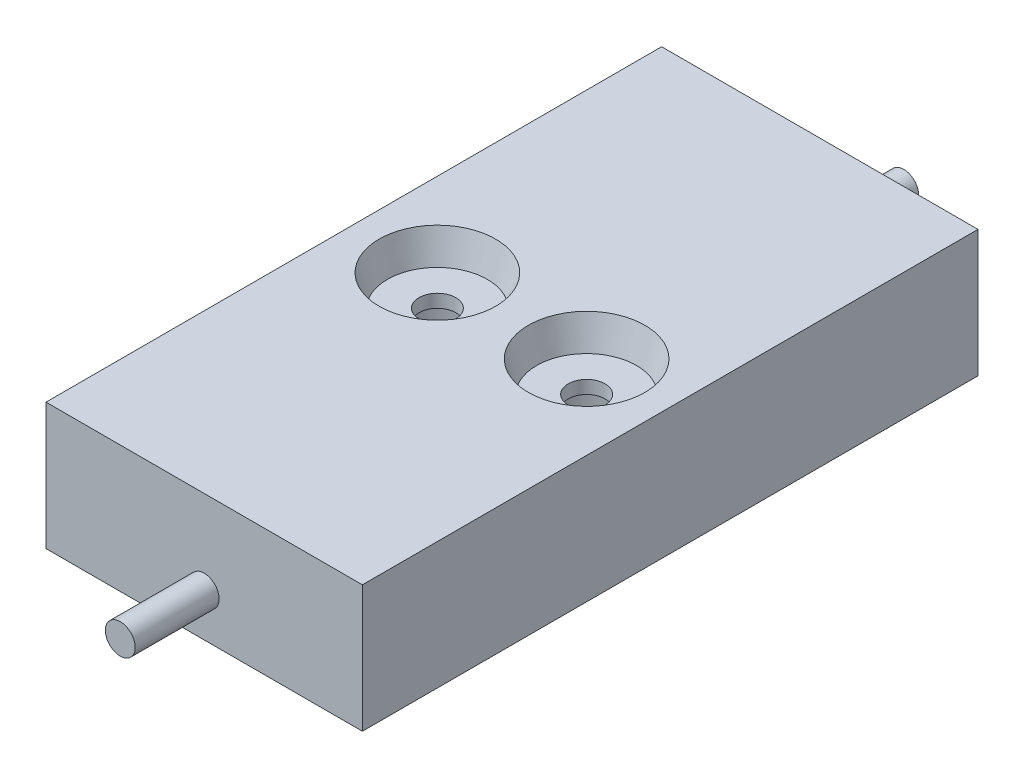
ISO-10303-21;
HEADER;
FILE_DESCRIPTION(('STEP AP214'),'2;1');
FILE_NAME('part.step','',(''),(''),'','','');
FILE_SCHEMA(('AUTOMOTIVE_DESIGN { 1 0 10303 214 1 1 1 1 }'));
ENDSEC;
DATA;
#1=APPLICATION_CONTEXT('core data for automotive mechanical design processes');
#2=APPLICATION_PROTOCOL_DEFINITION('international standard','automotive_design',2000,#1);
#3=PRODUCT_CONTEXT('',#1,'mechanical');
#4=PRODUCT('Part','Part','',(#3));
#5=PRODUCT_RELATED_PRODUCT_CATEGORY('part','',(#4));
#6=PRODUCT_DEFINITION_FORMATION('','',#4);
#7=PRODUCT_DEFINITION_CONTEXT('part definition',#1,'design');
#8=PRODUCT_DEFINITION('design','',#6,#7);
#9=PRODUCT_DEFINITION_SHAPE('','',#8);
#10=(LENGTH_UNIT() NAMED_UNIT(*) SI_UNIT(.MILLI.,.METRE.));
#11=(NAMED_UNIT(*) PLANE_ANGLE_UNIT() SI_UNIT($,.RADIAN.));
#12=(NAMED_UNIT(*) SI_UNIT($,.STERADIAN.) SOLID_ANGLE_UNIT());
#13=UNCERTAINTY_MEASURE_WITH_UNIT(LENGTH_MEASURE(1.E-05),#10,'distance_accuracy_value','');
#14=(GEOMETRIC_REPRESENTATION_CONTEXT(3) GLOBAL_UNCERTAINTY_ASSIGNED_CONTEXT((#13)) GLOBAL_UNIT_ASSIGNED_CONTEXT((#10,
#11,#12)) REPRESENTATION_CONTEXT('',''));
#15=CARTESIAN_POINT('',(0.,0.,0.));
#16=DIRECTION('',(0.,0.,1.));
#17=DIRECTION('',(1.,0.,0.));
#18=AXIS2_PLACEMENT_3D('',#15,#16,#17);
#19=CARTESIAN_POINT('',(0.,-12.5,105.));
#20=DIRECTION('',(0.,0.,-1.));
#21=DIRECTION('',(-1.,0.,0.));
#22=AXIS2_PLACEMENT_3D('',#19,#20,#21);
#23=CYLINDRICAL_SURFACE('',#22,4.);
#24=CARTESIAN_POINT('',(0.,-12.5,105.));
#25=DIRECTION('',(0.,0.,1.));
#26=DIRECTION('',(1.,0.,0.));
#27=AXIS2_PLACEMENT_3D('',#24,#25,#26);
#28=CIRCLE('',#27,4.);
#29=CARTESIAN_POINT('',(4.,-12.5,105.));
#30=VERTEX_POINT('',#29);
#31=EDGE_CURVE('E12',#30,#30,#28,.T.);
#32=ORIENTED_EDGE('',*,*,#31,.F.);
#33=EDGE_LOOP('',(#32));
#34=FACE_BOUND('',#33,.T.);
#35=CARTESIAN_POINT('',(0.,-12.5,-105.));
#36=DIRECTION('',(0.,0.,1.));
#37=DIRECTION('',(1.,0.,0.));
#38=AXIS2_PLACEMENT_3D('',#35,#36,#37);
#39=CIRCLE('',#38,4.);
#40=CARTESIAN_POINT('',(4.,-12.5,-105.));
#41=VERTEX_POINT('',#40);
#42=EDGE_CURVE('E62',#41,#41,#39,.T.);
#43=ORIENTED_EDGE('',*,*,#42,.T.);
#44=EDGE_LOOP('',(#43));
#45=FACE_BOUND('',#44,.T.);
#46=ADVANCED_FACE('F59',(#34,#45),#23,.T.);
#47=CARTESIAN_POINT('',(0.,-12.5,105.));
#48=DIRECTION('',(0.,0.,1.));
#49=DIRECTION('',(1.,0.,0.));
#50=AXIS2_PLACEMENT_3D('',#47,#48,#49);
#51=PLANE('',#50);
#52=ORIENTED_EDGE('',*,*,#31,.T.);
#53=EDGE_LOOP('',(#52));
#54=FACE_BOUND('',#53,.T.);
#55=ADVANCED_FACE('F77',(#54),#51,.T.);
#56=CARTESIAN_POINT('',(0.,-12.5,-105.));
#57=DIRECTION('',(0.,0.,1.));
#58=DIRECTION('',(1.,0.,0.));
#59=AXIS2_PLACEMENT_3D('',#56,#57,#58);
#60=PLANE('',#59);
#61=ORIENTED_EDGE('',*,*,#42,.F.);
#62=EDGE_LOOP('',(#61));
#63=FACE_BOUND('',#62,.T.);
#64=ADVANCED_FACE('F75',(#63),#60,.F.);
#65=CLOSED_SHELL('',(#46,#55,#64));
#66=MANIFOLD_SOLID_BREP('B2_NOT_SHOWN',#65);
#67=CARTESIAN_POINT('',(0.,-1.75,0.));
#68=DIRECTION('',(0.,1.,0.));
#69=DIRECTION('',(0.,0.,1.));
#70=AXIS2_PLACEMENT_3D('',#67,#68,#69);
#71=PLANE('',#70);
#72=CARTESIAN_POINT('',(20.,-1.75,0.));
#73=DIRECTION('',(0.,1.,0.));
#74=DIRECTION('',(0.,0.,1.));
#75=AXIS2_PLACEMENT_3D('',#72,#73,#74);
#76=CIRCLE('',#75,4.92500000000001);
#77=CARTESIAN_POINT('',(20.,-1.75,4.92500000000001));
#78=VERTEX_POINT('',#77);
#79=EDGE_CURVE('E210',#78,#78,#76,.T.);
#80=ORIENTED_EDGE('',*,*,#79,.T.);
#81=EDGE_LOOP('',(#80));
#82=FACE_BOUND('',#81,.T.);
#83=CARTESIAN_POINT('',(20.,-1.75,0.));
#84=DIRECTION('',(0.,1.,0.));
#85=DIRECTION('',(0.,0.,1.));
#86=AXIS2_PLACEMENT_3D('',#83,#84,#85);
#87=CIRCLE('',#86,13.4);
#88=CARTESIAN_POINT('',(20.,-1.75,13.4));
#89=VERTEX_POINT('',#88);
#90=EDGE_CURVE('E194',#89,#89,#87,.F.);
#91=ORIENTED_EDGE('',*,*,#90,.T.);
#92=EDGE_LOOP('',(#91));
#93=FACE_BOUND('',#92,.T.);
#94=ADVANCED_FACE('F105',(#82,#93),#71,.F.);
#95=CARTESIAN_POINT('',(0.,1.75,0.));
#96=DIRECTION('',(0.,1.,0.));
#97=DIRECTION('',(0.,0.,1.));
#98=AXIS2_PLACEMENT_3D('',#95,#96,#97);
#99=PLANE('',#98);
#100=CARTESIAN_POINT('',(20.,1.75,0.));
#101=DIRECTION('',(0.,1.,0.));
#102=DIRECTION('',(0.,0.,1.));
#103=AXIS2_PLACEMENT_3D('',#100,#101,#102);
#104=CIRCLE('',#103,4.92500000000001);
#105=CARTESIAN_POINT('',(20.,1.75,4.92500000000001));
#106=VERTEX_POINT('',#105);
#107=EDGE_CURVE('E203',#106,#106,#104,.T.);
#108=ORIENTED_EDGE('',*,*,#107,.F.);
#109=EDGE_LOOP('',(#108));
#110=FACE_BOUND('',#109,.T.);
#111=CARTESIAN_POINT('',(20.,1.75,0.));
#112=DIRECTION('',(0.,1.,0.));
#113=DIRECTION('',(0.,0.,1.));
#114=AXIS2_PLACEMENT_3D('',#111,#112,#113);
#115=CIRCLE('',#114,13.4);
#116=CARTESIAN_POINT('',(20.,1.75,13.4));
#117=VERTEX_POINT('',#116);
#118=EDGE_CURVE('E213',#117,#117,#115,.T.);
#119=ORIENTED_EDGE('',*,*,#118,.T.);
#120=EDGE_LOOP('',(#119));
#121=FACE_BOUND('',#120,.T.);
#122=ADVANCED_FACE('F251',(#110,#121),#99,.T.);
#123=CARTESIAN_POINT('',(42.4,1.75,0.));
#124=DIRECTION('',(1.,0.,0.));
#125=DIRECTION('',(0.,0.,-1.));
#126=AXIS2_PLACEMENT_3D('',#123,#124,#125);
#127=PLANE('',#126);
#128=DIRECTION('',(0.,-1.,0.));
#129=VECTOR('',#128,1.);
#130=CARTESIAN_POINT('',(42.4,1.75,82.5));
#131=LINE('',#130,#129);
#132=CARTESIAN_POINT('',(42.4,10.,82.5));
#133=VERTEX_POINT('',#132);
#134=CARTESIAN_POINT('',(42.4,-24.,82.5));
#135=VERTEX_POINT('',#134);
#136=EDGE_CURVE('E122',#133,#135,#131,.T.);
#137=ORIENTED_EDGE('',*,*,#136,.T.);
#138=DIRECTION('',(0.,0.,1.));
#139=VECTOR('',#138,1.);
#140=CARTESIAN_POINT('',(42.4,-24.,0.));
#141=LINE('',#140,#139);
#142=CARTESIAN_POINT('',(42.4,-24.,-82.5));
#143=VERTEX_POINT('',#142);
#144=EDGE_CURVE('E173',#143,#135,#141,.T.);
#145=ORIENTED_EDGE('',*,*,#144,.F.);
#146=DIRECTION('',(0.,-1.,0.));
#147=VECTOR('',#146,1.);
#148=CARTESIAN_POINT('',(42.4,1.75,-82.5));
#149=LINE('',#148,#147);
#150=CARTESIAN_POINT('',(42.4,10.,-82.5));
#151=VERTEX_POINT('',#150);
#152=EDGE_CURVE('E154',#151,#143,#149,.T.);
#153=ORIENTED_EDGE('',*,*,#152,.F.);
#154=DIRECTION('',(0.,0.,1.));
#155=VECTOR('',#154,1.);
#156=CARTESIAN_POINT('',(42.4,10.,0.));
#157=LINE('',#156,#155);
#158=EDGE_CURVE('E195',#151,#133,#157,.T.);
#159=ORIENTED_EDGE('',*,*,#158,.T.);
#160=EDGE_LOOP('',(#137,#145,#153,#159));
#161=FACE_BOUND('',#160,.T.);
#162=ADVANCED_FACE('F176',(#161),#127,.T.);
#163=CARTESIAN_POINT('',(0.,1.75,-82.5));
#164=DIRECTION('',(0.,0.,-1.));
#165=DIRECTION('',(-1.,0.,0.));
#166=AXIS2_PLACEMENT_3D('',#163,#164,#165);
#167=PLANE('',#166);
#168=CARTESIAN_POINT('',(0.,-12.5,-82.5));
#169=DIRECTION('',(0.,0.,1.));
#170=DIRECTION('',(1.,0.,0.));
#171=AXIS2_PLACEMENT_3D('',#168,#169,#170);
#172=CIRCLE('',#171,4.);
#173=CARTESIAN_POINT('',(4.,-12.5,-82.5));
#174=VERTEX_POINT('',#173);
#175=EDGE_CURVE('E177',#174,#174,#172,.T.);
#176=ORIENTED_EDGE('',*,*,#175,.T.);
#177=EDGE_LOOP('',(#176));
#178=FACE_BOUND('',#177,.T.);
#179=ORIENTED_EDGE('',*,*,#152,.T.);
#180=DIRECTION('',(1.,0.,0.));
#181=VECTOR('',#180,1.);
#182=CARTESIAN_POINT('',(0.,-24.,-82.5));
#183=LINE('',#182,#181);
#184=CARTESIAN_POINT('',(-42.4,-24.,-82.5));
#185=VERTEX_POINT('',#184);
#186=EDGE_CURVE('E157',#185,#143,#183,.T.);
#187=ORIENTED_EDGE('',*,*,#186,.F.);
#188=DIRECTION('',(0.,-1.,0.));
#189=VECTOR('',#188,1.);
#190=CARTESIAN_POINT('',(-42.4,1.75,-82.5));
#191=LINE('',#190,#189);
#192=CARTESIAN_POINT('',(-42.4,10.,-82.5));
#193=VERTEX_POINT('',#192);
#194=EDGE_CURVE('E166',#193,#185,#191,.T.);
#195=ORIENTED_EDGE('',*,*,#194,.F.);
#196=DIRECTION('',(1.,0.,0.));
#197=VECTOR('',#196,1.);
#198=CARTESIAN_POINT('',(0.,10.,-82.5));
#199=LINE('',#198,#197);
#200=EDGE_CURVE('E160',#193,#151,#199,.T.);
#201=ORIENTED_EDGE('',*,*,#200,.T.);
#202=EDGE_LOOP('',(#179,#187,#195,#201));
#203=FACE_BOUND('',#202,.T.);
#204=ADVANCED_FACE('F156',(#178,#203),#167,.T.);
#205=CARTESIAN_POINT('',(-42.4,1.75,0.));
#206=DIRECTION('',(1.,0.,0.));
#207=DIRECTION('',(0.,0.,-1.));
#208=AXIS2_PLACEMENT_3D('',#205,#206,#207);
#209=PLANE('',#208);
#210=ORIENTED_EDGE('',*,*,#194,.T.);
#211=DIRECTION('',(0.,0.,1.));
#212=VECTOR('',#211,1.);
#213=CARTESIAN_POINT('',(-42.4,-24.,0.));
#214=LINE('',#213,#212);
#215=CARTESIAN_POINT('',(-42.4,-24.,82.5));
#216=VERTEX_POINT('',#215);
#217=EDGE_CURVE('E174',#185,#216,#214,.T.);
#218=ORIENTED_EDGE('',*,*,#217,.T.);
#219=DIRECTION('',(0.,-1.,0.));
#220=VECTOR('',#219,1.);
#221=CARTESIAN_POINT('',(-42.4,1.75,82.5));
#222=LINE('',#221,#220);
#223=CARTESIAN_POINT('',(-42.4,10.,82.5));
#224=VERTEX_POINT('',#223);
#225=EDGE_CURVE('E132',#224,#216,#222,.T.);
#226=ORIENTED_EDGE('',*,*,#225,.F.);
#227=DIRECTION('',(0.,0.,1.));
#228=VECTOR('',#227,1.);
#229=CARTESIAN_POINT('',(-42.4,10.,0.));
#230=LINE('',#229,#228);
#231=EDGE_CURVE('E198',#193,#224,#230,.T.);
#232=ORIENTED_EDGE('',*,*,#231,.F.);
#233=EDGE_LOOP('',(#210,#218,#226,#232));
#234=FACE_BOUND('',#233,.T.);
#235=ADVANCED_FACE('F284',(#234),#209,.F.);
#236=CARTESIAN_POINT('',(20.,1.75,0.));
#237=DIRECTION('',(0.,-1.,0.));
#238=DIRECTION('',(0.,0.,-1.));
#239=AXIS2_PLACEMENT_3D('',#236,#237,#238);
#240=CYLINDRICAL_SURFACE('',#239,4.92500000000001);
#241=ORIENTED_EDGE('',*,*,#107,.T.);
#242=EDGE_LOOP('',(#241));
#243=FACE_BOUND('',#242,.T.);
#244=ORIENTED_EDGE('',*,*,#79,.F.);
#245=EDGE_LOOP('',(#244));
#246=FACE_BOUND('',#245,.T.);
#247=ADVANCED_FACE('F279',(#243,#246),#240,.F.);
#248=CARTESIAN_POINT('',(0.,1.75,82.5));
#249=DIRECTION('',(0.,0.,-1.));
#250=DIRECTION('',(-1.,0.,0.));
#251=AXIS2_PLACEMENT_3D('',#248,#249,#250);
#252=PLANE('',#251);
#253=CARTESIAN_POINT('',(0.,-12.5,82.5));
#254=DIRECTION('',(0.,0.,1.));
#255=DIRECTION('',(1.,0.,0.));
#256=AXIS2_PLACEMENT_3D('',#253,#254,#255);
#257=CIRCLE('',#256,4.);
#258=CARTESIAN_POINT('',(4.,-12.5,82.5));
#259=VERTEX_POINT('',#258);
#260=EDGE_CURVE('E181',#259,#259,#257,.T.);
#261=ORIENTED_EDGE('',*,*,#260,.F.);
#262=EDGE_LOOP('',(#261));
#263=FACE_BOUND('',#262,.T.);
#264=ORIENTED_EDGE('',*,*,#225,.T.);
#265=DIRECTION('',(1.,0.,0.));
#266=VECTOR('',#265,1.);
#267=CARTESIAN_POINT('',(0.,-24.,82.5));
#268=LINE('',#267,#266);
#269=EDGE_CURVE('E186',#216,#135,#268,.T.);
#270=ORIENTED_EDGE('',*,*,#269,.T.);
#271=ORIENTED_EDGE('',*,*,#136,.F.);
#272=DIRECTION('',(1.,0.,0.));
#273=VECTOR('',#272,1.);
#274=CARTESIAN_POINT('',(0.,10.,82.5));
#275=LINE('',#274,#273);
#276=EDGE_CURVE('E200',#224,#133,#275,.T.);
#277=ORIENTED_EDGE('',*,*,#276,.F.);
#278=EDGE_LOOP('',(#264,#270,#271,#277));
#279=FACE_BOUND('',#278,.T.);
#280=ADVANCED_FACE('F274',(#263,#279),#252,.F.);
#281=CARTESIAN_POINT('',(-20.,1.75,0.));
#282=DIRECTION('',(0.,-1.,0.));
#283=DIRECTION('',(0.,0.,-1.));
#284=AXIS2_PLACEMENT_3D('',#281,#282,#283);
#285=CYLINDRICAL_SURFACE('',#284,4.925);
#286=CARTESIAN_POINT('',(-20.,1.75,0.));
#287=DIRECTION('',(0.,1.,0.));
#288=DIRECTION('',(0.,0.,1.));
#289=AXIS2_PLACEMENT_3D('',#286,#287,#288);
#290=CIRCLE('',#289,4.925);
#291=CARTESIAN_POINT('',(-20.,1.75,4.925));
#292=VERTEX_POINT('',#291);
#293=EDGE_CURVE('E206',#292,#292,#290,.T.);
#294=ORIENTED_EDGE('',*,*,#293,.T.);
#295=EDGE_LOOP('',(#294));
#296=FACE_BOUND('',#295,.T.);
#297=CARTESIAN_POINT('',(-20.,-1.75,0.));
#298=DIRECTION('',(0.,1.,0.));
#299=DIRECTION('',(0.,0.,1.));
#300=AXIS2_PLACEMENT_3D('',#297,#298,#299);
#301=CIRCLE('',#300,4.925);
#302=CARTESIAN_POINT('',(-20.,-1.75,4.925));
#303=VERTEX_POINT('',#302);
#304=EDGE_CURVE('E207',#303,#303,#301,.T.);
#305=ORIENTED_EDGE('',*,*,#304,.F.);
#306=EDGE_LOOP('',(#305));
#307=FACE_BOUND('',#306,.T.);
#308=ADVANCED_FACE('F267',(#296,#307),#285,.F.);
#309=CARTESIAN_POINT('',(-20.,1.75,0.));
#310=DIRECTION('',(0.,1.,0.));
#311=DIRECTION('',(0.,0.,1.));
#312=AXIS2_PLACEMENT_3D('',#309,#310,#311);
#313=CIRCLE('',#312,13.4);
#314=CARTESIAN_POINT('',(-20.,1.75,13.4));
#315=VERTEX_POINT('',#314);
#316=EDGE_CURVE('E114',#315,#315,#313,.F.);
#317=ORIENTED_EDGE('',*,*,#316,.F.);
#318=EDGE_LOOP('',(#317));
#319=FACE_BOUND('',#318,.T.);
#320=ORIENTED_EDGE('',*,*,#293,.F.);
#321=EDGE_LOOP('',(#320));
#322=FACE_BOUND('',#321,.T.);
#323=ADVANCED_FACE('F259',(#319,#322),#99,.T.);
#324=CARTESIAN_POINT('',(-20.,-1.75,0.));
#325=DIRECTION('',(0.,1.,0.));
#326=DIRECTION('',(0.,0.,1.));
#327=AXIS2_PLACEMENT_3D('',#324,#325,#326);
#328=CIRCLE('',#327,13.4);
#329=CARTESIAN_POINT('',(-20.,-1.75,13.4));
#330=VERTEX_POINT('',#329);
#331=EDGE_CURVE('E57',#330,#330,#328,.T.);
#332=ORIENTED_EDGE('',*,*,#331,.F.);
#333=EDGE_LOOP('',(#332));
#334=FACE_BOUND('',#333,.T.);
#335=ORIENTED_EDGE('',*,*,#304,.T.);
#336=EDGE_LOOP('',(#335));
#337=FACE_BOUND('',#336,.T.);
#338=ADVANCED_FACE('F247',(#334,#337),#71,.F.);
#339=CARTESIAN_POINT('',(-20.,1.75,0.));
#340=DIRECTION('',(0.,1.,0.));
#341=DIRECTION('',(0.,0.,1.));
#342=AXIS2_PLACEMENT_3D('',#339,#340,#341);
#343=CONICAL_SURFACE('',#342,13.4,0.26179938779915);
#344=ORIENTED_EDGE('',*,*,#316,.T.);
#345=EDGE_LOOP('',(#344));
#346=FACE_BOUND('',#345,.T.);
#347=CARTESIAN_POINT('',(-20.,10.,0.));
#348=DIRECTION('',(0.,1.,0.));
#349=DIRECTION('',(0.,0.,1.));
#350=AXIS2_PLACEMENT_3D('',#347,#348,#349);
#351=CIRCLE('',#350,15.6105808375568);
#352=CARTESIAN_POINT('',(-20.,10.,15.6105808375568));
#353=VERTEX_POINT('',#352);
#354=EDGE_CURVE('E202',#353,#353,#351,.T.);
#355=ORIENTED_EDGE('',*,*,#354,.T.);
#356=EDGE_LOOP('',(#355));
#357=FACE_BOUND('',#356,.T.);
#358=ADVANCED_FACE('F238',(#346,#357),#343,.F.);
#359=CARTESIAN_POINT('',(20.,1.75,0.));
#360=DIRECTION('',(0.,1.,0.));
#361=DIRECTION('',(0.,0.,1.));
#362=AXIS2_PLACEMENT_3D('',#359,#360,#361);
#363=CONICAL_SURFACE('',#362,13.4,0.26179938779915);
#364=ORIENTED_EDGE('',*,*,#118,.F.);
#365=EDGE_LOOP('',(#364));
#366=FACE_BOUND('',#365,.T.);
#367=CARTESIAN_POINT('',(20.,10.,0.));
#368=DIRECTION('',(0.,1.,0.));
#369=DIRECTION('',(0.,0.,1.));
#370=AXIS2_PLACEMENT_3D('',#367,#368,#369);
#371=CIRCLE('',#370,15.6105808375568);
#372=CARTESIAN_POINT('',(20.,10.,15.6105808375568));
#373=VERTEX_POINT('',#372);
#374=EDGE_CURVE('E109',#373,#373,#371,.F.);
#375=ORIENTED_EDGE('',*,*,#374,.F.);
#376=EDGE_LOOP('',(#375));
#377=FACE_BOUND('',#376,.T.);
#378=ADVANCED_FACE('F107',(#366,#377),#363,.F.);
#379=CARTESIAN_POINT('',(0.,10.,0.));
#380=DIRECTION('',(0.,1.,0.));
#381=DIRECTION('',(0.,0.,1.));
#382=AXIS2_PLACEMENT_3D('',#379,#380,#381);
#383=PLANE('',#382);
#384=ORIENTED_EDGE('',*,*,#158,.F.);
#385=ORIENTED_EDGE('',*,*,#200,.F.);
#386=ORIENTED_EDGE('',*,*,#231,.T.);
#387=ORIENTED_EDGE('',*,*,#276,.T.);
#388=EDGE_LOOP('',(#384,#385,#386,#387));
#389=FACE_BOUND('',#388,.T.);
#390=ORIENTED_EDGE('',*,*,#354,.F.);
#391=EDGE_LOOP('',(#390));
#392=FACE_BOUND('',#391,.T.);
#393=ORIENTED_EDGE('',*,*,#374,.T.);
#394=EDGE_LOOP('',(#393));
#395=FACE_BOUND('',#394,.T.);
#396=ADVANCED_FACE('F235',(#389,#392,#395),#383,.T.);
#397=CARTESIAN_POINT('',(-20.,-24.,0.));
#398=DIRECTION('',(0.,1.,0.));
#399=DIRECTION('',(0.,0.,1.));
#400=AXIS2_PLACEMENT_3D('',#397,#398,#399);
#401=CYLINDRICAL_SURFACE('',#400,13.4);
#402=CARTESIAN_POINT('',(-20.,-24.,0.));
#403=DIRECTION('',(0.,1.,0.));
#404=DIRECTION('',(0.,0.,1.));
#405=AXIS2_PLACEMENT_3D('',#402,#403,#404);
#406=CIRCLE('',#405,13.4);
#407=CARTESIAN_POINT('',(-20.,-24.,13.4));
#408=VERTEX_POINT('',#407);
#409=EDGE_CURVE('E188',#408,#408,#406,.T.);
#410=ORIENTED_EDGE('',*,*,#409,.F.);
#411=EDGE_LOOP('',(#410));
#412=FACE_BOUND('',#411,.T.);
#413=ORIENTED_EDGE('',*,*,#331,.T.);
#414=EDGE_LOOP('',(#413));
#415=FACE_BOUND('',#414,.T.);
#416=ADVANCED_FACE('F244',(#412,#415),#401,.F.);
#417=CARTESIAN_POINT('',(20.,-24.,0.));
#418=DIRECTION('',(0.,1.,0.));
#419=DIRECTION('',(0.,0.,1.));
#420=AXIS2_PLACEMENT_3D('',#417,#418,#419);
#421=CYLINDRICAL_SURFACE('',#420,13.4);
#422=CARTESIAN_POINT('',(20.,-24.,0.));
#423=DIRECTION('',(0.,1.,0.));
#424=DIRECTION('',(0.,0.,1.));
#425=AXIS2_PLACEMENT_3D('',#422,#423,#424);
#426=CIRCLE('',#425,13.4);
#427=CARTESIAN_POINT('',(20.,-24.,13.4));
#428=VERTEX_POINT('',#427);
#429=EDGE_CURVE('E191',#428,#428,#426,.F.);
#430=ORIENTED_EDGE('',*,*,#429,.T.);
#431=EDGE_LOOP('',(#430));
#432=FACE_BOUND('',#431,.T.);
#433=ORIENTED_EDGE('',*,*,#90,.F.);
#434=EDGE_LOOP('',(#433));
#435=FACE_BOUND('',#434,.T.);
#436=ADVANCED_FACE('F356',(#432,#435),#421,.F.);
#437=CARTESIAN_POINT('',(0.,-24.,0.));
#438=DIRECTION('',(0.,1.,0.));
#439=DIRECTION('',(0.,0.,1.));
#440=AXIS2_PLACEMENT_3D('',#437,#438,#439);
#441=PLANE('',#440);
#442=ORIENTED_EDGE('',*,*,#144,.T.);
#443=ORIENTED_EDGE('',*,*,#269,.F.);
#444=ORIENTED_EDGE('',*,*,#217,.F.);
#445=ORIENTED_EDGE('',*,*,#186,.T.);
#446=EDGE_LOOP('',(#442,#443,#444,#445));
#447=FACE_BOUND('',#446,.T.);
#448=ORIENTED_EDGE('',*,*,#409,.T.);
#449=EDGE_LOOP('',(#448));
#450=FACE_BOUND('',#449,.T.);
#451=ORIENTED_EDGE('',*,*,#429,.F.);
#452=EDGE_LOOP('',(#451));
#453=FACE_BOUND('',#452,.T.);
#454=ADVANCED_FACE('F170',(#447,#450,#453),#441,.F.);
#455=CARTESIAN_POINT('',(0.,-12.5,-82.5));
#456=DIRECTION('',(0.,0.,1.));
#457=DIRECTION('',(1.,0.,0.));
#458=AXIS2_PLACEMENT_3D('',#455,#456,#457);
#459=CYLINDRICAL_SURFACE('',#458,4.);
#460=ORIENTED_EDGE('',*,*,#175,.F.);
#461=EDGE_LOOP('',(#460));
#462=FACE_BOUND('',#461,.T.);
#463=ORIENTED_EDGE('',*,*,#260,.T.);
#464=EDGE_LOOP('',(#463));
#465=FACE_BOUND('',#464,.T.);
#466=ADVANCED_FACE('F325',(#462,#465),#459,.F.);
#467=CLOSED_SHELL('',(#94,#122,#162,#204,#235,#247,#280,#308,#323,#338,#358,#378,#396,#416,#436,
#454,#466));
#468=MANIFOLD_SOLID_BREP('B7',#467);
#469=ADVANCED_BREP_SHAPE_REPRESENTATION('',(#18,#66,#468),#14);
#470=SHAPE_DEFINITION_REPRESENTATION(#9,#469);
ENDSEC;
END-ISO-10303-21;
